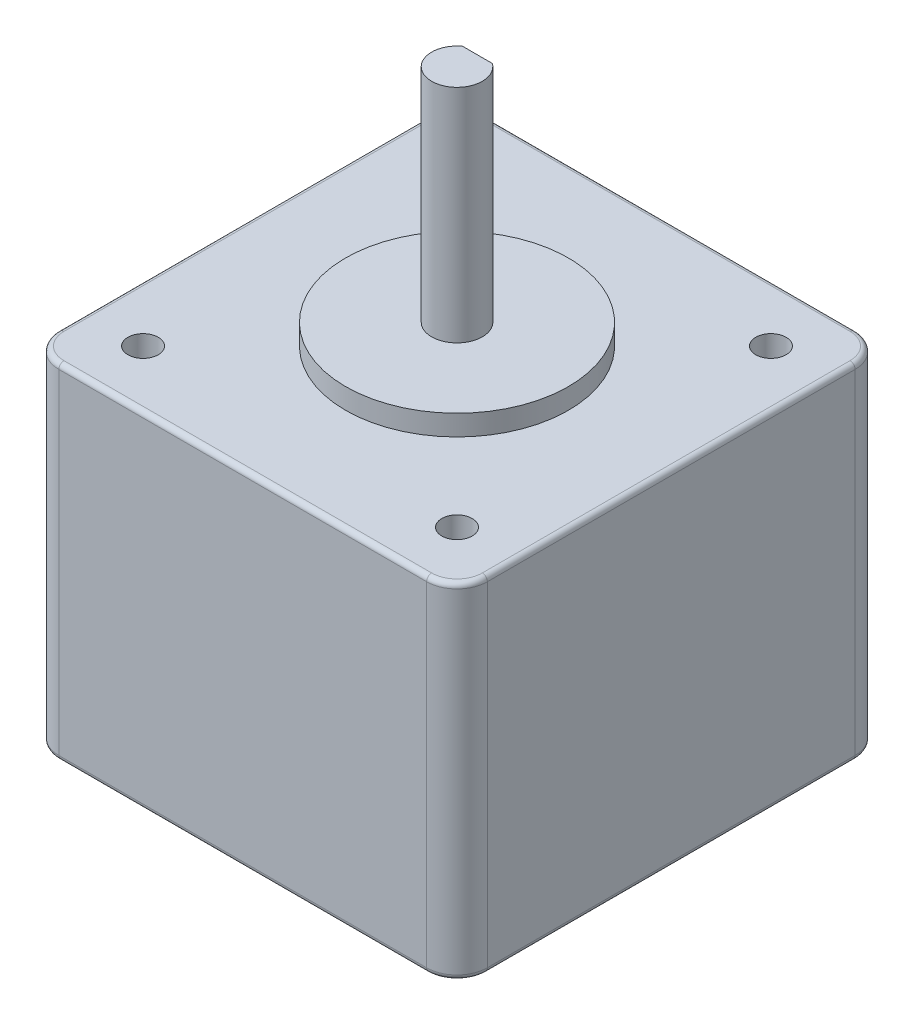
ISO-10303-21;
HEADER;
FILE_DESCRIPTION(('STEP AP214'),'2;1');
FILE_NAME('part.step','',(''),(''),'','','');
FILE_SCHEMA(('AUTOMOTIVE_DESIGN { 1 0 10303 214 1 1 1 1 }'));
ENDSEC;
DATA;
#1=APPLICATION_CONTEXT('core data for automotive mechanical design processes');
#2=APPLICATION_PROTOCOL_DEFINITION('international standard','automotive_design',2000,#1);
#3=PRODUCT_CONTEXT('',#1,'mechanical');
#4=PRODUCT('Part','Part','',(#3));
#5=PRODUCT_RELATED_PRODUCT_CATEGORY('part','',(#4));
#6=PRODUCT_DEFINITION_FORMATION('','',#4);
#7=PRODUCT_DEFINITION_CONTEXT('part definition',#1,'design');
#8=PRODUCT_DEFINITION('design','',#6,#7);
#9=PRODUCT_DEFINITION_SHAPE('','',#8);
#10=(LENGTH_UNIT() NAMED_UNIT(*) SI_UNIT(.MILLI.,.METRE.));
#11=(NAMED_UNIT(*) PLANE_ANGLE_UNIT() SI_UNIT($,.RADIAN.));
#12=(NAMED_UNIT(*) SI_UNIT($,.STERADIAN.) SOLID_ANGLE_UNIT());
#13=UNCERTAINTY_MEASURE_WITH_UNIT(LENGTH_MEASURE(1.E-05),#10,'distance_accuracy_value','');
#14=(GEOMETRIC_REPRESENTATION_CONTEXT(3) GLOBAL_UNCERTAINTY_ASSIGNED_CONTEXT((#13)) GLOBAL_UNIT_ASSIGNED_CONTEXT((#10,
#11,#12)) REPRESENTATION_CONTEXT('',''));
#15=CARTESIAN_POINT('',(0.,0.,0.));
#16=DIRECTION('',(0.,0.,1.));
#17=DIRECTION('',(1.,0.,0.));
#18=AXIS2_PLACEMENT_3D('',#15,#16,#17);
#19=CARTESIAN_POINT('',(0.,34.,0.));
#20=DIRECTION('',(0.,-1.,0.));
#21=DIRECTION('',(0.,0.,-1.));
#22=AXIS2_PLACEMENT_3D('',#19,#20,#21);
#23=PLANE('',#22);
#24=DIRECTION('',(0.,0.,1.));
#25=VECTOR('',#24,1.);
#26=CARTESIAN_POINT('',(0.5,34.,0.));
#27=LINE('',#26,#25);
#28=CARTESIAN_POINT('',(0.5,34.,-39.3));
#29=VERTEX_POINT('',#28);
#30=CARTESIAN_POINT('',(0.5,34.,-3.));
#31=VERTEX_POINT('',#30);
#32=EDGE_CURVE('E49',#29,#31,#27,.T.);
#33=ORIENTED_EDGE('',*,*,#32,.T.);
#34=CARTESIAN_POINT('',(3.,34.,-3.));
#35=DIRECTION('',(0.,-1.,0.));
#36=DIRECTION('',(0.,0.,-1.));
#37=AXIS2_PLACEMENT_3D('',#34,#35,#36);
#38=CIRCLE('',#37,2.5);
#39=CARTESIAN_POINT('',(3.,34.,-0.5));
#40=VERTEX_POINT('',#39);
#41=EDGE_CURVE('E299',#31,#40,#38,.F.);
#42=ORIENTED_EDGE('',*,*,#41,.T.);
#43=DIRECTION('',(1.,0.,0.));
#44=VECTOR('',#43,1.);
#45=CARTESIAN_POINT('',(0.,34.,-0.5));
#46=LINE('',#45,#44);
#47=CARTESIAN_POINT('',(39.3,34.,-0.5));
#48=VERTEX_POINT('',#47);
#49=EDGE_CURVE('E287',#40,#48,#46,.T.);
#50=ORIENTED_EDGE('',*,*,#49,.T.);
#51=CARTESIAN_POINT('',(39.3,34.,-3.));
#52=DIRECTION('',(0.,-1.,0.));
#53=DIRECTION('',(0.,0.,-1.));
#54=AXIS2_PLACEMENT_3D('',#51,#52,#53);
#55=CIRCLE('',#54,2.5);
#56=CARTESIAN_POINT('',(41.8,34.,-3.));
#57=VERTEX_POINT('',#56);
#58=EDGE_CURVE('E289',#48,#57,#55,.F.);
#59=ORIENTED_EDGE('',*,*,#58,.T.);
#60=DIRECTION('',(0.,0.,-1.));
#61=VECTOR('',#60,1.);
#62=CARTESIAN_POINT('',(41.8,34.,0.));
#63=LINE('',#62,#61);
#64=CARTESIAN_POINT('',(41.8,34.,-39.3));
#65=VERTEX_POINT('',#64);
#66=EDGE_CURVE('E291',#57,#65,#63,.T.);
#67=ORIENTED_EDGE('',*,*,#66,.T.);
#68=CARTESIAN_POINT('',(39.3,34.,-39.3));
#69=DIRECTION('',(0.,-1.,0.));
#70=DIRECTION('',(0.,0.,-1.));
#71=AXIS2_PLACEMENT_3D('',#68,#69,#70);
#72=CIRCLE('',#71,2.5);
#73=CARTESIAN_POINT('',(39.3,34.,-41.8));
#74=VERTEX_POINT('',#73);
#75=EDGE_CURVE('E293',#65,#74,#72,.F.);
#76=ORIENTED_EDGE('',*,*,#75,.T.);
#77=DIRECTION('',(-1.,0.,0.));
#78=VECTOR('',#77,1.);
#79=CARTESIAN_POINT('',(0.,34.,-41.8));
#80=LINE('',#79,#78);
#81=CARTESIAN_POINT('',(3.,34.,-41.8));
#82=VERTEX_POINT('',#81);
#83=EDGE_CURVE('E295',#74,#82,#80,.T.);
#84=ORIENTED_EDGE('',*,*,#83,.T.);
#85=CARTESIAN_POINT('',(3.,34.,-39.3));
#86=DIRECTION('',(0.,-1.,0.));
#87=DIRECTION('',(0.,0.,-1.));
#88=AXIS2_PLACEMENT_3D('',#85,#86,#87);
#89=CIRCLE('',#88,2.5);
#90=EDGE_CURVE('E54',#82,#29,#89,.F.);
#91=ORIENTED_EDGE('',*,*,#90,.T.);
#92=EDGE_LOOP('',(#33,#42,#50,#59,#67,#76,#84,#91));
#93=FACE_BOUND('',#92,.T.);
#94=CARTESIAN_POINT('',(21.15,34.,-21.15));
#95=DIRECTION('',(0.,1.,0.));
#96=DIRECTION('',(0.,0.,1.));
#97=AXIS2_PLACEMENT_3D('',#94,#95,#96);
#98=CIRCLE('',#97,11.);
#99=CARTESIAN_POINT('',(21.15,34.,-10.15));
#100=VERTEX_POINT('',#99);
#101=EDGE_CURVE('E188',#100,#100,#98,.T.);
#102=ORIENTED_EDGE('',*,*,#101,.F.);
#103=EDGE_LOOP('',(#102));
#104=FACE_BOUND('',#103,.T.);
#105=CARTESIAN_POINT('',(5.655,34.,-36.645));
#106=DIRECTION('',(0.,1.,0.));
#107=DIRECTION('',(0.,0.,1.));
#108=AXIS2_PLACEMENT_3D('',#105,#106,#107);
#109=CIRCLE('',#108,1.5);
#110=CARTESIAN_POINT('',(5.655,34.,-35.145));
#111=VERTEX_POINT('',#110);
#112=EDGE_CURVE('E194',#111,#111,#109,.T.);
#113=ORIENTED_EDGE('',*,*,#112,.F.);
#114=EDGE_LOOP('',(#113));
#115=FACE_BOUND('',#114,.T.);
#116=CARTESIAN_POINT('',(36.645,34.,-36.645));
#117=DIRECTION('',(0.,1.,0.));
#118=DIRECTION('',(0.,0.,1.));
#119=AXIS2_PLACEMENT_3D('',#116,#117,#118);
#120=CIRCLE('',#119,1.5);
#121=CARTESIAN_POINT('',(36.645,34.,-35.145));
#122=VERTEX_POINT('',#121);
#123=EDGE_CURVE('E207',#122,#122,#120,.T.);
#124=ORIENTED_EDGE('',*,*,#123,.F.);
#125=EDGE_LOOP('',(#124));
#126=FACE_BOUND('',#125,.T.);
#127=CARTESIAN_POINT('',(36.645,34.,-5.655));
#128=DIRECTION('',(0.,1.,0.));
#129=DIRECTION('',(0.,0.,1.));
#130=AXIS2_PLACEMENT_3D('',#127,#128,#129);
#131=CIRCLE('',#130,1.5);
#132=CARTESIAN_POINT('',(36.645,34.,-4.155));
#133=VERTEX_POINT('',#132);
#134=EDGE_CURVE('E201',#133,#133,#131,.T.);
#135=ORIENTED_EDGE('',*,*,#134,.F.);
#136=EDGE_LOOP('',(#135));
#137=FACE_BOUND('',#136,.T.);
#138=CARTESIAN_POINT('',(5.655,34.,-5.655));
#139=DIRECTION('',(0.,1.,0.));
#140=DIRECTION('',(0.,0.,1.));
#141=AXIS2_PLACEMENT_3D('',#138,#139,#140);
#142=CIRCLE('',#141,1.5);
#143=CARTESIAN_POINT('',(5.655,34.,-4.155));
#144=VERTEX_POINT('',#143);
#145=EDGE_CURVE('E195',#144,#144,#142,.T.);
#146=ORIENTED_EDGE('',*,*,#145,.F.);
#147=EDGE_LOOP('',(#146));
#148=FACE_BOUND('',#147,.T.);
#149=ADVANCED_FACE('F32',(#93,#104,#115,#126,#137,#148),#23,.F.);
#150=CARTESIAN_POINT('',(0.,0.,0.));
#151=DIRECTION('',(0.,-1.,0.));
#152=DIRECTION('',(0.,0.,-1.));
#153=AXIS2_PLACEMENT_3D('',#150,#151,#152);
#154=PLANE('',#153);
#155=DIRECTION('',(1.,0.,0.));
#156=VECTOR('',#155,1.);
#157=CARTESIAN_POINT('',(3.,0.,-0.5));
#158=LINE('',#157,#156);
#159=CARTESIAN_POINT('',(39.3,0.,-0.5));
#160=VERTEX_POINT('',#159);
#161=CARTESIAN_POINT('',(3.,0.,-0.5));
#162=VERTEX_POINT('',#161);
#163=EDGE_CURVE('E240',#160,#162,#158,.F.);
#164=ORIENTED_EDGE('',*,*,#163,.T.);
#165=CARTESIAN_POINT('',(3.,0.,-3.));
#166=DIRECTION('',(0.,-1.,0.));
#167=DIRECTION('',(0.,0.,-1.));
#168=AXIS2_PLACEMENT_3D('',#165,#166,#167);
#169=CIRCLE('',#168,2.5);
#170=CARTESIAN_POINT('',(0.5,0.,-3.));
#171=VERTEX_POINT('',#170);
#172=EDGE_CURVE('E254',#162,#171,#169,.T.);
#173=ORIENTED_EDGE('',*,*,#172,.T.);
#174=DIRECTION('',(0.,0.,1.));
#175=VECTOR('',#174,1.);
#176=CARTESIAN_POINT('',(0.5,0.,-39.3));
#177=LINE('',#176,#175);
#178=CARTESIAN_POINT('',(0.5,0.,-39.3));
#179=VERTEX_POINT('',#178);
#180=EDGE_CURVE('E252',#171,#179,#177,.F.);
#181=ORIENTED_EDGE('',*,*,#180,.T.);
#182=CARTESIAN_POINT('',(3.,0.,-39.3));
#183=DIRECTION('',(0.,-1.,0.));
#184=DIRECTION('',(0.,0.,-1.));
#185=AXIS2_PLACEMENT_3D('',#182,#183,#184);
#186=CIRCLE('',#185,2.5);
#187=CARTESIAN_POINT('',(3.,0.,-41.8));
#188=VERTEX_POINT('',#187);
#189=EDGE_CURVE('E250',#179,#188,#186,.T.);
#190=ORIENTED_EDGE('',*,*,#189,.T.);
#191=DIRECTION('',(-1.,0.,0.));
#192=VECTOR('',#191,1.);
#193=CARTESIAN_POINT('',(39.3,0.,-41.8));
#194=LINE('',#193,#192);
#195=CARTESIAN_POINT('',(39.3,0.,-41.8));
#196=VERTEX_POINT('',#195);
#197=EDGE_CURVE('E248',#188,#196,#194,.F.);
#198=ORIENTED_EDGE('',*,*,#197,.T.);
#199=CARTESIAN_POINT('',(39.3,0.,-39.3));
#200=DIRECTION('',(0.,-1.,0.));
#201=DIRECTION('',(0.,0.,-1.));
#202=AXIS2_PLACEMENT_3D('',#199,#200,#201);
#203=CIRCLE('',#202,2.5);
#204=CARTESIAN_POINT('',(41.8,0.,-39.3));
#205=VERTEX_POINT('',#204);
#206=EDGE_CURVE('E246',#196,#205,#203,.T.);
#207=ORIENTED_EDGE('',*,*,#206,.T.);
#208=DIRECTION('',(0.,0.,-1.));
#209=VECTOR('',#208,1.);
#210=CARTESIAN_POINT('',(41.8,0.,-3.));
#211=LINE('',#210,#209);
#212=CARTESIAN_POINT('',(41.8,0.,-3.));
#213=VERTEX_POINT('',#212);
#214=EDGE_CURVE('E244',#205,#213,#211,.F.);
#215=ORIENTED_EDGE('',*,*,#214,.T.);
#216=CARTESIAN_POINT('',(39.3,0.,-3.));
#217=DIRECTION('',(0.,-1.,0.));
#218=DIRECTION('',(0.,0.,-1.));
#219=AXIS2_PLACEMENT_3D('',#216,#217,#218);
#220=CIRCLE('',#219,2.5);
#221=EDGE_CURVE('E242',#213,#160,#220,.T.);
#222=ORIENTED_EDGE('',*,*,#221,.T.);
#223=EDGE_LOOP('',(#164,#173,#181,#190,#198,#207,#215,#222));
#224=FACE_BOUND('',#223,.T.);
#225=CARTESIAN_POINT('',(36.645,0.,-5.655));
#226=DIRECTION('',(0.,1.,0.));
#227=DIRECTION('',(0.,0.,1.));
#228=AXIS2_PLACEMENT_3D('',#225,#226,#227);
#229=CIRCLE('',#228,1.5);
#230=CARTESIAN_POINT('',(36.645,0.,-4.155));
#231=VERTEX_POINT('',#230);
#232=EDGE_CURVE('E198',#231,#231,#229,.T.);
#233=ORIENTED_EDGE('',*,*,#232,.T.);
#234=EDGE_LOOP('',(#233));
#235=FACE_BOUND('',#234,.T.);
#236=CARTESIAN_POINT('',(5.655,0.,-36.645));
#237=DIRECTION('',(0.,1.,0.));
#238=DIRECTION('',(0.,0.,1.));
#239=AXIS2_PLACEMENT_3D('',#236,#237,#238);
#240=CIRCLE('',#239,1.5);
#241=CARTESIAN_POINT('',(5.655,0.,-35.145));
#242=VERTEX_POINT('',#241);
#243=EDGE_CURVE('E210',#242,#242,#240,.T.);
#244=ORIENTED_EDGE('',*,*,#243,.T.);
#245=EDGE_LOOP('',(#244));
#246=FACE_BOUND('',#245,.T.);
#247=CARTESIAN_POINT('',(36.645,0.,-36.645));
#248=DIRECTION('',(0.,1.,0.));
#249=DIRECTION('',(0.,0.,1.));
#250=AXIS2_PLACEMENT_3D('',#247,#248,#249);
#251=CIRCLE('',#250,1.5);
#252=CARTESIAN_POINT('',(36.645,0.,-35.145));
#253=VERTEX_POINT('',#252);
#254=EDGE_CURVE('E204',#253,#253,#251,.T.);
#255=ORIENTED_EDGE('',*,*,#254,.T.);
#256=EDGE_LOOP('',(#255));
#257=FACE_BOUND('',#256,.T.);
#258=CARTESIAN_POINT('',(5.655,0.,-5.655));
#259=DIRECTION('',(0.,1.,0.));
#260=DIRECTION('',(0.,0.,1.));
#261=AXIS2_PLACEMENT_3D('',#258,#259,#260);
#262=CIRCLE('',#261,1.5);
#263=CARTESIAN_POINT('',(5.655,0.,-4.155));
#264=VERTEX_POINT('',#263);
#265=EDGE_CURVE('E191',#264,#264,#262,.T.);
#266=ORIENTED_EDGE('',*,*,#265,.T.);
#267=EDGE_LOOP('',(#266));
#268=FACE_BOUND('',#267,.T.);
#269=ADVANCED_FACE('F376',(#224,#235,#246,#257,#268),#154,.T.);
#270=CARTESIAN_POINT('',(0.,34.,0.));
#271=DIRECTION('',(1.,0.,0.));
#272=DIRECTION('',(0.,0.,-1.));
#273=AXIS2_PLACEMENT_3D('',#270,#271,#272);
#274=PLANE('',#273);
#275=DIRECTION('',(0.,-1.,0.));
#276=VECTOR('',#275,1.);
#277=CARTESIAN_POINT('',(0.,34.,-39.3));
#278=LINE('',#277,#276);
#279=CARTESIAN_POINT('',(0.,33.5,-39.3));
#280=VERTEX_POINT('',#279);
#281=CARTESIAN_POINT('',(0.,0.5,-39.3));
#282=VERTEX_POINT('',#281);
#283=EDGE_CURVE('E219',#280,#282,#278,.T.);
#284=ORIENTED_EDGE('',*,*,#283,.T.);
#285=DIRECTION('',(0.,0.,1.));
#286=VECTOR('',#285,1.);
#287=CARTESIAN_POINT('',(0.,0.5,-3.));
#288=LINE('',#287,#286);
#289=CARTESIAN_POINT('',(0.,0.5,-3.));
#290=VERTEX_POINT('',#289);
#291=EDGE_CURVE('E265',#282,#290,#288,.T.);
#292=ORIENTED_EDGE('',*,*,#291,.T.);
#293=DIRECTION('',(0.,-1.,0.));
#294=VECTOR('',#293,1.);
#295=CARTESIAN_POINT('',(0.,34.,-3.));
#296=LINE('',#295,#294);
#297=CARTESIAN_POINT('',(0.,33.5,-3.));
#298=VERTEX_POINT('',#297);
#299=EDGE_CURVE('E187',#290,#298,#296,.F.);
#300=ORIENTED_EDGE('',*,*,#299,.T.);
#301=DIRECTION('',(0.,0.,1.));
#302=VECTOR('',#301,1.);
#303=CARTESIAN_POINT('',(0.,33.5,0.));
#304=LINE('',#303,#302);
#305=EDGE_CURVE('E263',#298,#280,#304,.F.);
#306=ORIENTED_EDGE('',*,*,#305,.T.);
#307=EDGE_LOOP('',(#284,#292,#300,#306));
#308=FACE_BOUND('',#307,.T.);
#309=ADVANCED_FACE('F407',(#308),#274,.F.);
#310=CARTESIAN_POINT('',(0.,34.,0.));
#311=DIRECTION('',(0.,0.,-1.));
#312=DIRECTION('',(-1.,0.,0.));
#313=AXIS2_PLACEMENT_3D('',#310,#311,#312);
#314=PLANE('',#313);
#315=DIRECTION('',(0.,-1.,0.));
#316=VECTOR('',#315,1.);
#317=CARTESIAN_POINT('',(3.,34.,0.));
#318=LINE('',#317,#316);
#319=CARTESIAN_POINT('',(3.,33.5,0.));
#320=VERTEX_POINT('',#319);
#321=CARTESIAN_POINT('',(3.,0.5,0.));
#322=VERTEX_POINT('',#321);
#323=EDGE_CURVE('E234',#320,#322,#318,.T.);
#324=ORIENTED_EDGE('',*,*,#323,.T.);
#325=DIRECTION('',(1.,0.,0.));
#326=VECTOR('',#325,1.);
#327=CARTESIAN_POINT('',(39.3,0.5,0.));
#328=LINE('',#327,#326);
#329=CARTESIAN_POINT('',(39.3,0.5,0.));
#330=VERTEX_POINT('',#329);
#331=EDGE_CURVE('E11',#322,#330,#328,.T.);
#332=ORIENTED_EDGE('',*,*,#331,.T.);
#333=DIRECTION('',(0.,-1.,0.));
#334=VECTOR('',#333,1.);
#335=CARTESIAN_POINT('',(39.3,34.,0.));
#336=LINE('',#335,#334);
#337=CARTESIAN_POINT('',(39.3,33.5,0.));
#338=VERTEX_POINT('',#337);
#339=EDGE_CURVE('E237',#330,#338,#336,.F.);
#340=ORIENTED_EDGE('',*,*,#339,.T.);
#341=DIRECTION('',(1.,0.,0.));
#342=VECTOR('',#341,1.);
#343=CARTESIAN_POINT('',(0.,33.5,0.));
#344=LINE('',#343,#342);
#345=EDGE_CURVE('E41',#338,#320,#344,.F.);
#346=ORIENTED_EDGE('',*,*,#345,.T.);
#347=EDGE_LOOP('',(#324,#332,#340,#346));
#348=FACE_BOUND('',#347,.T.);
#349=ADVANCED_FACE('F421',(#348),#314,.F.);
#350=CARTESIAN_POINT('',(42.3,34.,0.));
#351=DIRECTION('',(-1.,0.,0.));
#352=DIRECTION('',(0.,0.,1.));
#353=AXIS2_PLACEMENT_3D('',#350,#351,#352);
#354=PLANE('',#353);
#355=DIRECTION('',(0.,-1.,0.));
#356=VECTOR('',#355,1.);
#357=CARTESIAN_POINT('',(42.3,34.,-3.));
#358=LINE('',#357,#356);
#359=CARTESIAN_POINT('',(42.3,33.5,-3.));
#360=VERTEX_POINT('',#359);
#361=CARTESIAN_POINT('',(42.3,0.5,-3.));
#362=VERTEX_POINT('',#361);
#363=EDGE_CURVE('E228',#360,#362,#358,.T.);
#364=ORIENTED_EDGE('',*,*,#363,.T.);
#365=DIRECTION('',(0.,0.,-1.));
#366=VECTOR('',#365,1.);
#367=CARTESIAN_POINT('',(42.3,0.5,-39.3));
#368=LINE('',#367,#366);
#369=CARTESIAN_POINT('',(42.3,0.5,-39.3));
#370=VERTEX_POINT('',#369);
#371=EDGE_CURVE('E281',#362,#370,#368,.T.);
#372=ORIENTED_EDGE('',*,*,#371,.T.);
#373=DIRECTION('',(0.,-1.,0.));
#374=VECTOR('',#373,1.);
#375=CARTESIAN_POINT('',(42.3,34.,-39.3));
#376=LINE('',#375,#374);
#377=CARTESIAN_POINT('',(42.3,33.5,-39.3));
#378=VERTEX_POINT('',#377);
#379=EDGE_CURVE('E231',#370,#378,#376,.F.);
#380=ORIENTED_EDGE('',*,*,#379,.T.);
#381=DIRECTION('',(0.,0.,-1.));
#382=VECTOR('',#381,1.);
#383=CARTESIAN_POINT('',(42.3,33.5,0.));
#384=LINE('',#383,#382);
#385=EDGE_CURVE('E279',#378,#360,#384,.F.);
#386=ORIENTED_EDGE('',*,*,#385,.T.);
#387=EDGE_LOOP('',(#364,#372,#380,#386));
#388=FACE_BOUND('',#387,.T.);
#389=ADVANCED_FACE('F361',(#388),#354,.F.);
#390=CARTESIAN_POINT('',(0.,34.,-42.3));
#391=DIRECTION('',(0.,0.,1.));
#392=DIRECTION('',(1.,0.,0.));
#393=AXIS2_PLACEMENT_3D('',#390,#391,#392);
#394=PLANE('',#393);
#395=DIRECTION('',(0.,-1.,0.));
#396=VECTOR('',#395,1.);
#397=CARTESIAN_POINT('',(39.3,34.,-42.3));
#398=LINE('',#397,#396);
#399=CARTESIAN_POINT('',(39.3,33.5,-42.3));
#400=VERTEX_POINT('',#399);
#401=CARTESIAN_POINT('',(39.3,0.5,-42.3));
#402=VERTEX_POINT('',#401);
#403=EDGE_CURVE('E222',#400,#402,#398,.T.);
#404=ORIENTED_EDGE('',*,*,#403,.T.);
#405=DIRECTION('',(-1.,0.,0.));
#406=VECTOR('',#405,1.);
#407=CARTESIAN_POINT('',(3.,0.5,-42.3));
#408=LINE('',#407,#406);
#409=CARTESIAN_POINT('',(3.,0.5,-42.3));
#410=VERTEX_POINT('',#409);
#411=EDGE_CURVE('E273',#402,#410,#408,.T.);
#412=ORIENTED_EDGE('',*,*,#411,.T.);
#413=DIRECTION('',(0.,-1.,0.));
#414=VECTOR('',#413,1.);
#415=CARTESIAN_POINT('',(3.,34.,-42.3));
#416=LINE('',#415,#414);
#417=CARTESIAN_POINT('',(3.,33.5,-42.3));
#418=VERTEX_POINT('',#417);
#419=EDGE_CURVE('E225',#410,#418,#416,.F.);
#420=ORIENTED_EDGE('',*,*,#419,.T.);
#421=DIRECTION('',(-1.,0.,0.));
#422=VECTOR('',#421,1.);
#423=CARTESIAN_POINT('',(0.,33.5,-42.3));
#424=LINE('',#423,#422);
#425=EDGE_CURVE('E271',#418,#400,#424,.F.);
#426=ORIENTED_EDGE('',*,*,#425,.T.);
#427=EDGE_LOOP('',(#404,#412,#420,#426));
#428=FACE_BOUND('',#427,.T.);
#429=ADVANCED_FACE('F386',(#428),#394,.F.);
#430=CARTESIAN_POINT('',(5.655,34.,-36.645));
#431=DIRECTION('',(0.,-1.,0.));
#432=DIRECTION('',(0.,0.,-1.));
#433=AXIS2_PLACEMENT_3D('',#430,#431,#432);
#434=CYLINDRICAL_SURFACE('',#433,1.5);
#435=ORIENTED_EDGE('',*,*,#112,.T.);
#436=EDGE_LOOP('',(#435));
#437=FACE_BOUND('',#436,.T.);
#438=ORIENTED_EDGE('',*,*,#243,.F.);
#439=EDGE_LOOP('',(#438));
#440=FACE_BOUND('',#439,.T.);
#441=ADVANCED_FACE('F460',(#437,#440),#434,.F.);
#442=CARTESIAN_POINT('',(36.645,34.,-36.645));
#443=DIRECTION('',(0.,-1.,0.));
#444=DIRECTION('',(0.,0.,-1.));
#445=AXIS2_PLACEMENT_3D('',#442,#443,#444);
#446=CYLINDRICAL_SURFACE('',#445,1.5);
#447=ORIENTED_EDGE('',*,*,#123,.T.);
#448=EDGE_LOOP('',(#447));
#449=FACE_BOUND('',#448,.T.);
#450=ORIENTED_EDGE('',*,*,#254,.F.);
#451=EDGE_LOOP('',(#450));
#452=FACE_BOUND('',#451,.T.);
#453=ADVANCED_FACE('F670',(#449,#452),#446,.F.);
#454=CARTESIAN_POINT('',(36.645,34.,-5.655));
#455=DIRECTION('',(0.,-1.,0.));
#456=DIRECTION('',(0.,0.,-1.));
#457=AXIS2_PLACEMENT_3D('',#454,#455,#456);
#458=CYLINDRICAL_SURFACE('',#457,1.5);
#459=ORIENTED_EDGE('',*,*,#134,.T.);
#460=EDGE_LOOP('',(#459));
#461=FACE_BOUND('',#460,.T.);
#462=ORIENTED_EDGE('',*,*,#232,.F.);
#463=EDGE_LOOP('',(#462));
#464=FACE_BOUND('',#463,.T.);
#465=ADVANCED_FACE('F661',(#461,#464),#458,.F.);
#466=CARTESIAN_POINT('',(5.655,34.,-5.655));
#467=DIRECTION('',(0.,-1.,0.));
#468=DIRECTION('',(0.,0.,-1.));
#469=AXIS2_PLACEMENT_3D('',#466,#467,#468);
#470=CYLINDRICAL_SURFACE('',#469,1.5);
#471=ORIENTED_EDGE('',*,*,#145,.T.);
#472=EDGE_LOOP('',(#471));
#473=FACE_BOUND('',#472,.T.);
#474=ORIENTED_EDGE('',*,*,#265,.F.);
#475=EDGE_LOOP('',(#474));
#476=FACE_BOUND('',#475,.T.);
#477=ADVANCED_FACE('F652',(#473,#476),#470,.F.);
#478=CARTESIAN_POINT('',(21.15,36.03,-21.15));
#479=DIRECTION('',(0.,-1.,0.));
#480=DIRECTION('',(0.,0.,-1.));
#481=AXIS2_PLACEMENT_3D('',#478,#479,#480);
#482=CYLINDRICAL_SURFACE('',#481,11.);
#483=CARTESIAN_POINT('',(21.15,36.03,-21.15));
#484=DIRECTION('',(0.,1.,0.));
#485=DIRECTION('',(0.,0.,1.));
#486=AXIS2_PLACEMENT_3D('',#483,#484,#485);
#487=CIRCLE('',#486,11.);
#488=CARTESIAN_POINT('',(21.15,36.03,-10.15));
#489=VERTEX_POINT('',#488);
#490=EDGE_CURVE('E183',#489,#489,#487,.T.);
#491=ORIENTED_EDGE('',*,*,#490,.F.);
#492=EDGE_LOOP('',(#491));
#493=FACE_BOUND('',#492,.T.);
#494=ORIENTED_EDGE('',*,*,#101,.T.);
#495=EDGE_LOOP('',(#494));
#496=FACE_BOUND('',#495,.T.);
#497=ADVANCED_FACE('F643',(#493,#496),#482,.T.);
#498=CARTESIAN_POINT('',(21.15,36.03,-21.15));
#499=DIRECTION('',(0.,1.,0.));
#500=DIRECTION('',(0.,0.,1.));
#501=AXIS2_PLACEMENT_3D('',#498,#499,#500);
#502=PLANE('',#501);
#503=CARTESIAN_POINT('',(21.15,36.03,-21.15));
#504=DIRECTION('',(0.,1.,0.));
#505=DIRECTION('',(0.,0.,1.));
#506=AXIS2_PLACEMENT_3D('',#503,#504,#505);
#507=CIRCLE('',#506,2.5);
#508=CARTESIAN_POINT('',(21.15,36.03,-18.65));
#509=VERTEX_POINT('',#508);
#510=EDGE_CURVE('E184',#509,#509,#507,.T.);
#511=ORIENTED_EDGE('',*,*,#510,.F.);
#512=EDGE_LOOP('',(#511));
#513=FACE_BOUND('',#512,.T.);
#514=ORIENTED_EDGE('',*,*,#490,.T.);
#515=EDGE_LOOP('',(#514));
#516=FACE_BOUND('',#515,.T.);
#517=ADVANCED_FACE('F635',(#513,#516),#502,.T.);
#518=CARTESIAN_POINT('',(21.15,57.88,-21.15));
#519=DIRECTION('',(0.,-1.,0.));
#520=DIRECTION('',(0.,0.,-1.));
#521=AXIS2_PLACEMENT_3D('',#518,#519,#520);
#522=CYLINDRICAL_SURFACE('',#521,2.5);
#523=CARTESIAN_POINT('',(21.15,57.88,-21.15));
#524=DIRECTION('',(0.,1.,0.));
#525=DIRECTION('',(0.,0.,1.));
#526=AXIS2_PLACEMENT_3D('',#523,#524,#525);
#527=CIRCLE('',#526,2.5);
#528=CARTESIAN_POINT('',(19.6770437888383,57.88,-23.17));
#529=VERTEX_POINT('',#528);
#530=CARTESIAN_POINT('',(22.6229562111618,57.88,-23.17));
#531=VERTEX_POINT('',#530);
#532=EDGE_CURVE('E177',#529,#531,#527,.T.);
#533=ORIENTED_EDGE('',*,*,#532,.F.);
#534=DIRECTION('',(0.,1.,0.));
#535=VECTOR('',#534,1.);
#536=CARTESIAN_POINT('',(19.6770437888383,43.02,-23.17));
#537=LINE('',#536,#535);
#538=CARTESIAN_POINT('',(19.6770437888383,43.02,-23.17));
#539=VERTEX_POINT('',#538);
#540=EDGE_CURVE('E169',#539,#529,#537,.T.);
#541=ORIENTED_EDGE('',*,*,#540,.F.);
#542=CARTESIAN_POINT('',(21.15,43.02,-21.15));
#543=DIRECTION('',(0.,1.,0.));
#544=DIRECTION('',(0.,0.,-1.));
#545=AXIS2_PLACEMENT_3D('',#542,#543,#544);
#546=CIRCLE('',#545,2.5);
#547=CARTESIAN_POINT('',(22.6229562111618,43.02,-23.17));
#548=VERTEX_POINT('',#547);
#549=EDGE_CURVE('E158',#548,#539,#546,.T.);
#550=ORIENTED_EDGE('',*,*,#549,.F.);
#551=DIRECTION('',(0.,1.,0.));
#552=VECTOR('',#551,1.);
#553=CARTESIAN_POINT('',(22.6229562111618,43.02,-23.17));
#554=LINE('',#553,#552);
#555=EDGE_CURVE('E171',#548,#531,#554,.T.);
#556=ORIENTED_EDGE('',*,*,#555,.T.);
#557=EDGE_LOOP('',(#533,#541,#550,#556));
#558=FACE_BOUND('',#557,.T.);
#559=ORIENTED_EDGE('',*,*,#510,.T.);
#560=EDGE_LOOP('',(#559));
#561=FACE_BOUND('',#560,.T.);
#562=ADVANCED_FACE('F174',(#558,#561),#522,.T.);
#563=CARTESIAN_POINT('',(21.15,57.88,-21.15));
#564=DIRECTION('',(0.,1.,0.));
#565=DIRECTION('',(0.,0.,1.));
#566=AXIS2_PLACEMENT_3D('',#563,#564,#565);
#567=PLANE('',#566);
#568=DIRECTION('',(1.,0.,0.));
#569=VECTOR('',#568,1.);
#570=CARTESIAN_POINT('',(19.6770437888383,57.88,-23.17));
#571=LINE('',#570,#569);
#572=EDGE_CURVE('E165',#529,#531,#571,.T.);
#573=ORIENTED_EDGE('',*,*,#572,.F.);
#574=ORIENTED_EDGE('',*,*,#532,.T.);
#575=EDGE_LOOP('',(#573,#574));
#576=FACE_BOUND('',#575,.T.);
#577=ADVANCED_FACE('F619',(#576),#567,.T.);
#578=CARTESIAN_POINT('',(19.6770437888383,43.02,-23.17));
#579=DIRECTION('',(0.,0.,1.));
#580=DIRECTION('',(1.,0.,0.));
#581=AXIS2_PLACEMENT_3D('',#578,#579,#580);
#582=PLANE('',#581);
#583=ORIENTED_EDGE('',*,*,#572,.T.);
#584=ORIENTED_EDGE('',*,*,#555,.F.);
#585=DIRECTION('',(1.,0.,0.));
#586=VECTOR('',#585,1.);
#587=CARTESIAN_POINT('',(19.6770437888383,43.02,-23.17));
#588=LINE('',#587,#586);
#589=EDGE_CURVE('E161',#539,#548,#588,.T.);
#590=ORIENTED_EDGE('',*,*,#589,.F.);
#591=ORIENTED_EDGE('',*,*,#540,.T.);
#592=EDGE_LOOP('',(#583,#584,#590,#591));
#593=FACE_BOUND('',#592,.T.);
#594=ADVANCED_FACE('F168',(#593),#582,.F.);
#595=CARTESIAN_POINT('',(21.15,43.02,-21.15));
#596=DIRECTION('',(0.,-1.,0.));
#597=DIRECTION('',(0.,0.,-1.));
#598=AXIS2_PLACEMENT_3D('',#595,#596,#597);
#599=PLANE('',#598);
#600=ORIENTED_EDGE('',*,*,#549,.T.);
#601=ORIENTED_EDGE('',*,*,#589,.T.);
#602=EDGE_LOOP('',(#600,#601));
#603=FACE_BOUND('',#602,.T.);
#604=ADVANCED_FACE('F160',(#603),#599,.F.);
#605=CARTESIAN_POINT('',(3.,34.,-39.3));
#606=DIRECTION('',(0.,-1.,0.));
#607=DIRECTION('',(0.,0.,-1.));
#608=AXIS2_PLACEMENT_3D('',#605,#606,#607);
#609=CYLINDRICAL_SURFACE('',#608,3.);
#610=ORIENTED_EDGE('',*,*,#419,.F.);
#611=CARTESIAN_POINT('',(3.,0.5,-39.3));
#612=DIRECTION('',(0.,-1.,0.));
#613=DIRECTION('',(0.,0.,-1.));
#614=AXIS2_PLACEMENT_3D('',#611,#612,#613);
#615=CIRCLE('',#614,3.);
#616=EDGE_CURVE('E269',#410,#282,#615,.F.);
#617=ORIENTED_EDGE('',*,*,#616,.T.);
#618=ORIENTED_EDGE('',*,*,#283,.F.);
#619=CARTESIAN_POINT('',(3.,33.5,-39.3));
#620=DIRECTION('',(0.,-1.,0.));
#621=DIRECTION('',(0.,0.,-1.));
#622=AXIS2_PLACEMENT_3D('',#619,#620,#621);
#623=CIRCLE('',#622,3.);
#624=EDGE_CURVE('E267',#280,#418,#623,.T.);
#625=ORIENTED_EDGE('',*,*,#624,.T.);
#626=EDGE_LOOP('',(#610,#617,#618,#625));
#627=FACE_BOUND('',#626,.T.);
#628=ADVANCED_FACE('F390',(#627),#609,.T.);
#629=CARTESIAN_POINT('',(39.3,34.,-39.3));
#630=DIRECTION('',(0.,-1.,0.));
#631=DIRECTION('',(0.,0.,-1.));
#632=AXIS2_PLACEMENT_3D('',#629,#630,#631);
#633=CYLINDRICAL_SURFACE('',#632,3.);
#634=ORIENTED_EDGE('',*,*,#379,.F.);
#635=CARTESIAN_POINT('',(39.3,0.5,-39.3));
#636=DIRECTION('',(0.,-1.,0.));
#637=DIRECTION('',(0.,0.,-1.));
#638=AXIS2_PLACEMENT_3D('',#635,#636,#637);
#639=CIRCLE('',#638,3.);
#640=EDGE_CURVE('E277',#370,#402,#639,.F.);
#641=ORIENTED_EDGE('',*,*,#640,.T.);
#642=ORIENTED_EDGE('',*,*,#403,.F.);
#643=CARTESIAN_POINT('',(39.3,33.5,-39.3));
#644=DIRECTION('',(0.,-1.,0.));
#645=DIRECTION('',(0.,0.,-1.));
#646=AXIS2_PLACEMENT_3D('',#643,#644,#645);
#647=CIRCLE('',#646,3.);
#648=EDGE_CURVE('E275',#400,#378,#647,.T.);
#649=ORIENTED_EDGE('',*,*,#648,.T.);
#650=EDGE_LOOP('',(#634,#641,#642,#649));
#651=FACE_BOUND('',#650,.T.);
#652=ADVANCED_FACE('F358',(#651),#633,.T.);
#653=CARTESIAN_POINT('',(39.3,34.,-3.));
#654=DIRECTION('',(0.,-1.,0.));
#655=DIRECTION('',(0.,0.,-1.));
#656=AXIS2_PLACEMENT_3D('',#653,#654,#655);
#657=CYLINDRICAL_SURFACE('',#656,3.);
#658=ORIENTED_EDGE('',*,*,#339,.F.);
#659=CARTESIAN_POINT('',(39.3,0.5,-3.));
#660=DIRECTION('',(0.,-1.,0.));
#661=DIRECTION('',(0.,0.,-1.));
#662=AXIS2_PLACEMENT_3D('',#659,#660,#661);
#663=CIRCLE('',#662,3.);
#664=EDGE_CURVE('E285',#330,#362,#663,.F.);
#665=ORIENTED_EDGE('',*,*,#664,.T.);
#666=ORIENTED_EDGE('',*,*,#363,.F.);
#667=CARTESIAN_POINT('',(39.3,33.5,-3.));
#668=DIRECTION('',(0.,-1.,0.));
#669=DIRECTION('',(0.,0.,-1.));
#670=AXIS2_PLACEMENT_3D('',#667,#668,#669);
#671=CIRCLE('',#670,3.);
#672=EDGE_CURVE('E283',#360,#338,#671,.T.);
#673=ORIENTED_EDGE('',*,*,#672,.T.);
#674=EDGE_LOOP('',(#658,#665,#666,#673));
#675=FACE_BOUND('',#674,.T.);
#676=ADVANCED_FACE('F424',(#675),#657,.T.);
#677=CARTESIAN_POINT('',(3.,34.,-3.));
#678=DIRECTION('',(0.,-1.,0.));
#679=DIRECTION('',(0.,0.,-1.));
#680=AXIS2_PLACEMENT_3D('',#677,#678,#679);
#681=CYLINDRICAL_SURFACE('',#680,3.);
#682=ORIENTED_EDGE('',*,*,#299,.F.);
#683=CARTESIAN_POINT('',(3.,0.5,-3.));
#684=DIRECTION('',(0.,-1.,0.));
#685=DIRECTION('',(0.,0.,-1.));
#686=AXIS2_PLACEMENT_3D('',#683,#684,#685);
#687=CIRCLE('',#686,3.);
#688=EDGE_CURVE('E260',#290,#322,#687,.F.);
#689=ORIENTED_EDGE('',*,*,#688,.T.);
#690=ORIENTED_EDGE('',*,*,#323,.F.);
#691=CARTESIAN_POINT('',(3.,33.5,-3.));
#692=DIRECTION('',(0.,-1.,0.));
#693=DIRECTION('',(0.,0.,-1.));
#694=AXIS2_PLACEMENT_3D('',#691,#692,#693);
#695=CIRCLE('',#694,3.);
#696=EDGE_CURVE('E257',#320,#298,#695,.T.);
#697=ORIENTED_EDGE('',*,*,#696,.T.);
#698=EDGE_LOOP('',(#682,#689,#690,#697));
#699=FACE_BOUND('',#698,.T.);
#700=ADVANCED_FACE('F410',(#699),#681,.T.);
#701=CARTESIAN_POINT('',(39.3,0.5,-39.3));
#702=DIRECTION('',(0.,-1.,0.));
#703=DIRECTION('',(0.,0.,-1.));
#704=AXIS2_PLACEMENT_3D('',#701,#702,#703);
#705=TOROIDAL_SURFACE('',#704,2.5,0.5);
#706=CARTESIAN_POINT('',(39.3,0.5,-41.8));
#707=DIRECTION('',(-1.,0.,0.));
#708=DIRECTION('',(0.,0.,1.));
#709=AXIS2_PLACEMENT_3D('',#706,#707,#708);
#710=CIRCLE('',#709,0.5);
#711=EDGE_CURVE('E318',#402,#196,#710,.T.);
#712=ORIENTED_EDGE('',*,*,#711,.F.);
#713=ORIENTED_EDGE('',*,*,#640,.F.);
#714=CARTESIAN_POINT('',(41.8,0.5,-39.3));
#715=DIRECTION('',(0.,0.,1.));
#716=DIRECTION('',(1.,0.,0.));
#717=AXIS2_PLACEMENT_3D('',#714,#715,#716);
#718=CIRCLE('',#717,0.5);
#719=EDGE_CURVE('E321',#205,#370,#718,.T.);
#720=ORIENTED_EDGE('',*,*,#719,.F.);
#721=ORIENTED_EDGE('',*,*,#206,.F.);
#722=EDGE_LOOP('',(#712,#713,#720,#721));
#723=FACE_BOUND('',#722,.T.);
#724=ADVANCED_FACE('F383',(#723),#705,.T.);
#725=CARTESIAN_POINT('',(41.8,0.5,0.));
#726=DIRECTION('',(0.,0.,1.));
#727=DIRECTION('',(1.,0.,0.));
#728=AXIS2_PLACEMENT_3D('',#725,#726,#727);
#729=CYLINDRICAL_SURFACE('',#728,0.5);
#730=ORIENTED_EDGE('',*,*,#719,.T.);
#731=ORIENTED_EDGE('',*,*,#371,.F.);
#732=CARTESIAN_POINT('',(41.8,0.5,-3.));
#733=DIRECTION('',(0.,0.,1.));
#734=DIRECTION('',(1.,0.,0.));
#735=AXIS2_PLACEMENT_3D('',#732,#733,#734);
#736=CIRCLE('',#735,0.5);
#737=EDGE_CURVE('E315',#213,#362,#736,.T.);
#738=ORIENTED_EDGE('',*,*,#737,.F.);
#739=ORIENTED_EDGE('',*,*,#214,.F.);
#740=EDGE_LOOP('',(#730,#731,#738,#739));
#741=FACE_BOUND('',#740,.T.);
#742=ADVANCED_FACE('F366',(#741),#729,.T.);
#743=CARTESIAN_POINT('',(0.,0.5,-41.8));
#744=DIRECTION('',(1.,0.,0.));
#745=DIRECTION('',(0.,0.,-1.));
#746=AXIS2_PLACEMENT_3D('',#743,#744,#745);
#747=CYLINDRICAL_SURFACE('',#746,0.5);
#748=ORIENTED_EDGE('',*,*,#711,.T.);
#749=ORIENTED_EDGE('',*,*,#197,.F.);
#750=CARTESIAN_POINT('',(3.,0.5,-41.8));
#751=DIRECTION('',(-1.,0.,0.));
#752=DIRECTION('',(0.,0.,1.));
#753=AXIS2_PLACEMENT_3D('',#750,#751,#752);
#754=CIRCLE('',#753,0.5);
#755=EDGE_CURVE('E312',#410,#188,#754,.T.);
#756=ORIENTED_EDGE('',*,*,#755,.F.);
#757=ORIENTED_EDGE('',*,*,#411,.F.);
#758=EDGE_LOOP('',(#748,#749,#756,#757));
#759=FACE_BOUND('',#758,.T.);
#760=ADVANCED_FACE('F395',(#759),#747,.T.);
#761=CARTESIAN_POINT('',(39.3,0.5,-3.));
#762=DIRECTION('',(0.,-1.,0.));
#763=DIRECTION('',(0.,0.,-1.));
#764=AXIS2_PLACEMENT_3D('',#761,#762,#763);
#765=TOROIDAL_SURFACE('',#764,2.5,0.5);
#766=ORIENTED_EDGE('',*,*,#737,.T.);
#767=ORIENTED_EDGE('',*,*,#664,.F.);
#768=CARTESIAN_POINT('',(39.3,0.5,-0.5));
#769=DIRECTION('',(-1.,0.,0.));
#770=DIRECTION('',(0.,0.,1.));
#771=AXIS2_PLACEMENT_3D('',#768,#769,#770);
#772=CIRCLE('',#771,0.5);
#773=EDGE_CURVE('E309',#160,#330,#772,.T.);
#774=ORIENTED_EDGE('',*,*,#773,.F.);
#775=ORIENTED_EDGE('',*,*,#221,.F.);
#776=EDGE_LOOP('',(#766,#767,#774,#775));
#777=FACE_BOUND('',#776,.T.);
#778=ADVANCED_FACE('F372',(#777),#765,.T.);
#779=CARTESIAN_POINT('',(3.,0.5,-39.3));
#780=DIRECTION('',(0.,-1.,0.));
#781=DIRECTION('',(0.,0.,-1.));
#782=AXIS2_PLACEMENT_3D('',#779,#780,#781);
#783=TOROIDAL_SURFACE('',#782,2.5,0.5);
#784=ORIENTED_EDGE('',*,*,#755,.T.);
#785=ORIENTED_EDGE('',*,*,#189,.F.);
#786=CARTESIAN_POINT('',(0.5,0.5,-39.3));
#787=DIRECTION('',(0.,0.,1.));
#788=DIRECTION('',(1.,0.,0.));
#789=AXIS2_PLACEMENT_3D('',#786,#787,#788);
#790=CIRCLE('',#789,0.5);
#791=EDGE_CURVE('E306',#282,#179,#790,.T.);
#792=ORIENTED_EDGE('',*,*,#791,.F.);
#793=ORIENTED_EDGE('',*,*,#616,.F.);
#794=EDGE_LOOP('',(#784,#785,#792,#793));
#795=FACE_BOUND('',#794,.T.);
#796=ADVANCED_FACE('F399',(#795),#783,.T.);
#797=CARTESIAN_POINT('',(0.,0.5,-0.5));
#798=DIRECTION('',(-1.,0.,0.));
#799=DIRECTION('',(0.,0.,1.));
#800=AXIS2_PLACEMENT_3D('',#797,#798,#799);
#801=CYLINDRICAL_SURFACE('',#800,0.5);
#802=ORIENTED_EDGE('',*,*,#773,.T.);
#803=ORIENTED_EDGE('',*,*,#331,.F.);
#804=CARTESIAN_POINT('',(3.,0.5,-0.5));
#805=DIRECTION('',(-1.,0.,0.));
#806=DIRECTION('',(0.,0.,1.));
#807=AXIS2_PLACEMENT_3D('',#804,#805,#806);
#808=CIRCLE('',#807,0.5);
#809=EDGE_CURVE('E304',#162,#322,#808,.T.);
#810=ORIENTED_EDGE('',*,*,#809,.F.);
#811=ORIENTED_EDGE('',*,*,#163,.F.);
#812=EDGE_LOOP('',(#802,#803,#810,#811));
#813=FACE_BOUND('',#812,.T.);
#814=ADVANCED_FACE('F418',(#813),#801,.T.);
#815=CARTESIAN_POINT('',(0.5,0.5,0.));
#816=DIRECTION('',(0.,0.,-1.));
#817=DIRECTION('',(-1.,0.,0.));
#818=AXIS2_PLACEMENT_3D('',#815,#816,#817);
#819=CYLINDRICAL_SURFACE('',#818,0.5);
#820=ORIENTED_EDGE('',*,*,#791,.T.);
#821=ORIENTED_EDGE('',*,*,#180,.F.);
#822=CARTESIAN_POINT('',(0.5,0.5,-3.));
#823=DIRECTION('',(0.,0.,1.));
#824=DIRECTION('',(1.,0.,0.));
#825=AXIS2_PLACEMENT_3D('',#822,#823,#824);
#826=CIRCLE('',#825,0.5);
#827=EDGE_CURVE('E302',#290,#171,#826,.T.);
#828=ORIENTED_EDGE('',*,*,#827,.F.);
#829=ORIENTED_EDGE('',*,*,#291,.F.);
#830=EDGE_LOOP('',(#820,#821,#828,#829));
#831=FACE_BOUND('',#830,.T.);
#832=ADVANCED_FACE('F404',(#831),#819,.T.);
#833=CARTESIAN_POINT('',(3.,0.5,-3.));
#834=DIRECTION('',(0.,-1.,0.));
#835=DIRECTION('',(0.,0.,-1.));
#836=AXIS2_PLACEMENT_3D('',#833,#834,#835);
#837=TOROIDAL_SURFACE('',#836,2.5,0.5);
#838=ORIENTED_EDGE('',*,*,#809,.T.);
#839=ORIENTED_EDGE('',*,*,#688,.F.);
#840=ORIENTED_EDGE('',*,*,#827,.T.);
#841=ORIENTED_EDGE('',*,*,#172,.F.);
#842=EDGE_LOOP('',(#838,#839,#840,#841));
#843=FACE_BOUND('',#842,.T.);
#844=ADVANCED_FACE('F414',(#843),#837,.T.);
#845=CARTESIAN_POINT('',(39.3,33.5,-39.3));
#846=DIRECTION('',(0.,-1.,0.));
#847=DIRECTION('',(0.,0.,-1.));
#848=AXIS2_PLACEMENT_3D('',#845,#846,#847);
#849=TOROIDAL_SURFACE('',#848,2.5,0.5);
#850=CARTESIAN_POINT('',(41.8,33.5,-39.3));
#851=DIRECTION('',(0.,0.,1.));
#852=DIRECTION('',(1.,0.,0.));
#853=AXIS2_PLACEMENT_3D('',#850,#851,#852);
#854=CIRCLE('',#853,0.5);
#855=EDGE_CURVE('E339',#378,#65,#854,.T.);
#856=ORIENTED_EDGE('',*,*,#855,.F.);
#857=ORIENTED_EDGE('',*,*,#648,.F.);
#858=CARTESIAN_POINT('',(39.3,33.5,-41.8));
#859=DIRECTION('',(-1.,0.,0.));
#860=DIRECTION('',(0.,0.,1.));
#861=AXIS2_PLACEMENT_3D('',#858,#859,#860);
#862=CIRCLE('',#861,0.5);
#863=EDGE_CURVE('E36',#74,#400,#862,.T.);
#864=ORIENTED_EDGE('',*,*,#863,.F.);
#865=ORIENTED_EDGE('',*,*,#75,.F.);
#866=EDGE_LOOP('',(#856,#857,#864,#865));
#867=FACE_BOUND('',#866,.T.);
#868=ADVANCED_FACE('F34',(#867),#849,.T.);
#869=CARTESIAN_POINT('',(0.,33.5,-41.8));
#870=DIRECTION('',(-1.,0.,0.));
#871=DIRECTION('',(0.,0.,1.));
#872=AXIS2_PLACEMENT_3D('',#869,#870,#871);
#873=CYLINDRICAL_SURFACE('',#872,0.5);
#874=ORIENTED_EDGE('',*,*,#863,.T.);
#875=ORIENTED_EDGE('',*,*,#425,.F.);
#876=CARTESIAN_POINT('',(3.,33.5,-41.8));
#877=DIRECTION('',(-1.,0.,0.));
#878=DIRECTION('',(0.,0.,1.));
#879=AXIS2_PLACEMENT_3D('',#876,#877,#878);
#880=CIRCLE('',#879,0.5);
#881=EDGE_CURVE('E337',#82,#418,#880,.T.);
#882=ORIENTED_EDGE('',*,*,#881,.F.);
#883=ORIENTED_EDGE('',*,*,#83,.F.);
#884=EDGE_LOOP('',(#874,#875,#882,#883));
#885=FACE_BOUND('',#884,.T.);
#886=ADVANCED_FACE('F350',(#885),#873,.T.);
#887=CARTESIAN_POINT('',(41.8,33.5,0.));
#888=DIRECTION('',(0.,0.,-1.));
#889=DIRECTION('',(-1.,0.,0.));
#890=AXIS2_PLACEMENT_3D('',#887,#888,#889);
#891=CYLINDRICAL_SURFACE('',#890,0.5);
#892=ORIENTED_EDGE('',*,*,#855,.T.);
#893=ORIENTED_EDGE('',*,*,#66,.F.);
#894=CARTESIAN_POINT('',(41.8,33.5,-3.));
#895=DIRECTION('',(0.,0.,1.));
#896=DIRECTION('',(1.,0.,0.));
#897=AXIS2_PLACEMENT_3D('',#894,#895,#896);
#898=CIRCLE('',#897,0.5);
#899=EDGE_CURVE('E334',#360,#57,#898,.T.);
#900=ORIENTED_EDGE('',*,*,#899,.F.);
#901=ORIENTED_EDGE('',*,*,#385,.F.);
#902=EDGE_LOOP('',(#892,#893,#900,#901));
#903=FACE_BOUND('',#902,.T.);
#904=ADVANCED_FACE('F444',(#903),#891,.T.);
#905=CARTESIAN_POINT('',(3.,33.5,-39.3));
#906=DIRECTION('',(0.,-1.,0.));
#907=DIRECTION('',(0.,0.,-1.));
#908=AXIS2_PLACEMENT_3D('',#905,#906,#907);
#909=TOROIDAL_SURFACE('',#908,2.5,0.5);
#910=ORIENTED_EDGE('',*,*,#881,.T.);
#911=ORIENTED_EDGE('',*,*,#624,.F.);
#912=CARTESIAN_POINT('',(0.5,33.5,-39.3));
#913=DIRECTION('',(0.,0.,1.));
#914=DIRECTION('',(1.,0.,0.));
#915=AXIS2_PLACEMENT_3D('',#912,#913,#914);
#916=CIRCLE('',#915,0.5);
#917=EDGE_CURVE('E331',#29,#280,#916,.T.);
#918=ORIENTED_EDGE('',*,*,#917,.F.);
#919=ORIENTED_EDGE('',*,*,#90,.F.);
#920=EDGE_LOOP('',(#910,#911,#918,#919));
#921=FACE_BOUND('',#920,.T.);
#922=ADVANCED_FACE('F442',(#921),#909,.T.);
#923=CARTESIAN_POINT('',(39.3,33.5,-3.));
#924=DIRECTION('',(0.,-1.,0.));
#925=DIRECTION('',(0.,0.,-1.));
#926=AXIS2_PLACEMENT_3D('',#923,#924,#925);
#927=TOROIDAL_SURFACE('',#926,2.5,0.5);
#928=ORIENTED_EDGE('',*,*,#899,.T.);
#929=ORIENTED_EDGE('',*,*,#58,.F.);
#930=CARTESIAN_POINT('',(39.3,33.5,-0.5));
#931=DIRECTION('',(-1.,0.,0.));
#932=DIRECTION('',(0.,0.,1.));
#933=AXIS2_PLACEMENT_3D('',#930,#931,#932);
#934=CIRCLE('',#933,0.5);
#935=EDGE_CURVE('E328',#338,#48,#934,.T.);
#936=ORIENTED_EDGE('',*,*,#935,.F.);
#937=ORIENTED_EDGE('',*,*,#672,.F.);
#938=EDGE_LOOP('',(#928,#929,#936,#937));
#939=FACE_BOUND('',#938,.T.);
#940=ADVANCED_FACE('F428',(#939),#927,.T.);
#941=CARTESIAN_POINT('',(0.5,33.5,0.));
#942=DIRECTION('',(0.,0.,1.));
#943=DIRECTION('',(1.,0.,0.));
#944=AXIS2_PLACEMENT_3D('',#941,#942,#943);
#945=CYLINDRICAL_SURFACE('',#944,0.5);
#946=ORIENTED_EDGE('',*,*,#917,.T.);
#947=ORIENTED_EDGE('',*,*,#305,.F.);
#948=CARTESIAN_POINT('',(0.5,33.5,-3.));
#949=DIRECTION('',(0.,0.,1.));
#950=DIRECTION('',(1.,0.,0.));
#951=AXIS2_PLACEMENT_3D('',#948,#949,#950);
#952=CIRCLE('',#951,0.5);
#953=EDGE_CURVE('E326',#31,#298,#952,.T.);
#954=ORIENTED_EDGE('',*,*,#953,.F.);
#955=ORIENTED_EDGE('',*,*,#32,.F.);
#956=EDGE_LOOP('',(#946,#947,#954,#955));
#957=FACE_BOUND('',#956,.T.);
#958=ADVANCED_FACE('F440',(#957),#945,.T.);
#959=CARTESIAN_POINT('',(0.,33.5,-0.5));
#960=DIRECTION('',(1.,0.,0.));
#961=DIRECTION('',(0.,0.,-1.));
#962=AXIS2_PLACEMENT_3D('',#959,#960,#961);
#963=CYLINDRICAL_SURFACE('',#962,0.5);
#964=ORIENTED_EDGE('',*,*,#935,.T.);
#965=ORIENTED_EDGE('',*,*,#49,.F.);
#966=CARTESIAN_POINT('',(3.,33.5,-0.5));
#967=DIRECTION('',(-1.,0.,0.));
#968=DIRECTION('',(0.,0.,1.));
#969=AXIS2_PLACEMENT_3D('',#966,#967,#968);
#970=CIRCLE('',#969,0.5);
#971=EDGE_CURVE('E324',#320,#40,#970,.T.);
#972=ORIENTED_EDGE('',*,*,#971,.F.);
#973=ORIENTED_EDGE('',*,*,#345,.F.);
#974=EDGE_LOOP('',(#964,#965,#972,#973));
#975=FACE_BOUND('',#974,.T.);
#976=ADVANCED_FACE('F434',(#975),#963,.T.);
#977=CARTESIAN_POINT('',(3.,33.5,-3.));
#978=DIRECTION('',(0.,-1.,0.));
#979=DIRECTION('',(0.,0.,-1.));
#980=AXIS2_PLACEMENT_3D('',#977,#978,#979);
#981=TOROIDAL_SURFACE('',#980,2.5,0.5);
#982=ORIENTED_EDGE('',*,*,#953,.T.);
#983=ORIENTED_EDGE('',*,*,#696,.F.);
#984=ORIENTED_EDGE('',*,*,#971,.T.);
#985=ORIENTED_EDGE('',*,*,#41,.F.);
#986=EDGE_LOOP('',(#982,#983,#984,#985));
#987=FACE_BOUND('',#986,.T.);
#988=ADVANCED_FACE('F436',(#987),#981,.T.);
#989=CLOSED_SHELL('',(#149,#269,#309,#349,#389,#429,#441,#453,#465,#477,#497,#517,#562,#577,
#594,#604,#628,#652,#676,#700,#724,#742,#760,#778,#796,#814,#832,#844,#868,#886,#904,#922,#940,
#958,#976,#988));
#990=MANIFOLD_SOLID_BREP('B2',#989);
#991=ADVANCED_BREP_SHAPE_REPRESENTATION('',(#18,#990),#14);
#992=SHAPE_DEFINITION_REPRESENTATION(#9,#991);
ENDSEC;
END-ISO-10303-21;
